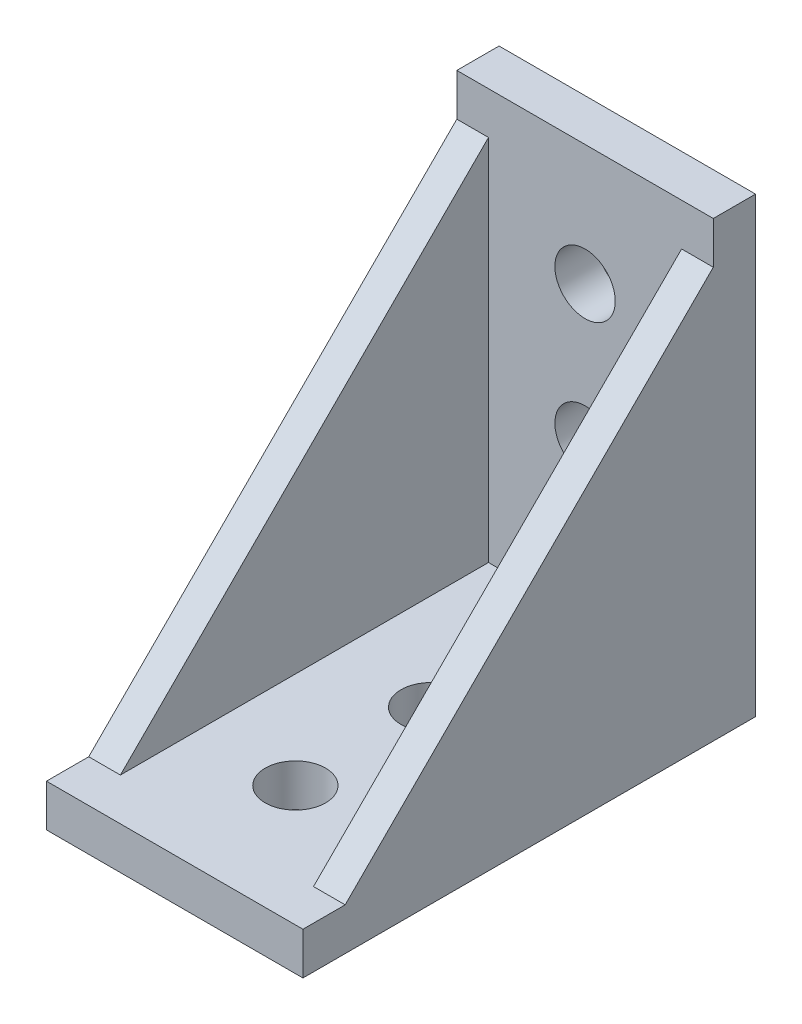
ISO-10303-21;
HEADER;
FILE_DESCRIPTION(('STEP AP214'),'2;1');
FILE_NAME('part.step','',(''),(''),'','','');
FILE_SCHEMA(('AUTOMOTIVE_DESIGN { 1 0 10303 214 1 1 1 1 }'));
ENDSEC;
DATA;
#1=APPLICATION_CONTEXT('core data for automotive mechanical design processes');
#2=APPLICATION_PROTOCOL_DEFINITION('international standard','automotive_design',2000,#1);
#3=PRODUCT_CONTEXT('',#1,'mechanical');
#4=PRODUCT('Part','Part','',(#3));
#5=PRODUCT_RELATED_PRODUCT_CATEGORY('part','',(#4));
#6=PRODUCT_DEFINITION_FORMATION('','',#4);
#7=PRODUCT_DEFINITION_CONTEXT('part definition',#1,'design');
#8=PRODUCT_DEFINITION('design','',#6,#7);
#9=PRODUCT_DEFINITION_SHAPE('','',#8);
#10=(LENGTH_UNIT() NAMED_UNIT(*) SI_UNIT(.MILLI.,.METRE.));
#11=(NAMED_UNIT(*) PLANE_ANGLE_UNIT() SI_UNIT($,.RADIAN.));
#12=(NAMED_UNIT(*) SI_UNIT($,.STERADIAN.) SOLID_ANGLE_UNIT());
#13=UNCERTAINTY_MEASURE_WITH_UNIT(LENGTH_MEASURE(1.E-05),#10,'distance_accuracy_value','');
#14=(GEOMETRIC_REPRESENTATION_CONTEXT(3) GLOBAL_UNCERTAINTY_ASSIGNED_CONTEXT((#13)) GLOBAL_UNIT_ASSIGNED_CONTEXT((#10,
#11,#12)) REPRESENTATION_CONTEXT('',''));
#15=CARTESIAN_POINT('',(0.,0.,0.));
#16=DIRECTION('',(0.,0.,1.));
#17=DIRECTION('',(1.,0.,0.));
#18=AXIS2_PLACEMENT_3D('',#15,#16,#17);
#19=CARTESIAN_POINT('',(17.,2.8,27.2));
#20=DIRECTION('',(0.,-0.707106781186547,-0.707106781186548));
#21=DIRECTION('',(0.,0.707106781186548,-0.707106781186547));
#22=AXIS2_PLACEMENT_3D('',#19,#20,#21);
#23=PLANE('',#22);
#24=DIRECTION('',(-1.,0.,0.));
#25=VECTOR('',#24,1.);
#26=CARTESIAN_POINT('',(17.,27.2,2.8));
#27=LINE('',#26,#25);
#28=CARTESIAN_POINT('',(17.,27.2,2.8));
#29=VERTEX_POINT('',#28);
#30=CARTESIAN_POINT('',(14.9,27.2,2.8));
#31=VERTEX_POINT('',#30);
#32=EDGE_CURVE('E157',#29,#31,#27,.T.);
#33=ORIENTED_EDGE('',*,*,#32,.T.);
#34=DIRECTION('',(0.,-0.707106781186548,0.707106781186547));
#35=VECTOR('',#34,1.);
#36=CARTESIAN_POINT('',(14.9,2.8,27.2));
#37=LINE('',#36,#35);
#38=CARTESIAN_POINT('',(14.9,2.79999999999999,27.2));
#39=VERTEX_POINT('',#38);
#40=EDGE_CURVE('E11',#31,#39,#37,.T.);
#41=ORIENTED_EDGE('',*,*,#40,.T.);
#42=DIRECTION('',(-1.,0.,0.));
#43=VECTOR('',#42,1.);
#44=CARTESIAN_POINT('',(17.,2.8,27.2));
#45=LINE('',#44,#43);
#46=CARTESIAN_POINT('',(17.,2.8,27.2));
#47=VERTEX_POINT('',#46);
#48=EDGE_CURVE('E154',#47,#39,#45,.T.);
#49=ORIENTED_EDGE('',*,*,#48,.F.);
#50=DIRECTION('',(0.,-0.707106781186548,0.707106781186547));
#51=VECTOR('',#50,1.);
#52=CARTESIAN_POINT('',(17.,2.8,27.2));
#53=LINE('',#52,#51);
#54=EDGE_CURVE('E115',#29,#47,#53,.T.);
#55=ORIENTED_EDGE('',*,*,#54,.F.);
#56=EDGE_LOOP('',(#33,#41,#49,#55));
#57=FACE_BOUND('',#56,.T.);
#58=ADVANCED_FACE('F34',(#57),#23,.F.);
#59=CARTESIAN_POINT('',(17.,30.,0.));
#60=DIRECTION('',(0.,0.,1.));
#61=DIRECTION('',(0.,-1.,0.));
#62=AXIS2_PLACEMENT_3D('',#59,#60,#61);
#63=PLANE('',#62);
#64=CARTESIAN_POINT('',(8.5,22.,0.));
#65=DIRECTION('',(0.,0.,1.));
#66=DIRECTION('',(1.,0.,0.));
#67=AXIS2_PLACEMENT_3D('',#64,#65,#66);
#68=CIRCLE('',#67,2.);
#69=CARTESIAN_POINT('',(10.5,22.,0.));
#70=VERTEX_POINT('',#69);
#71=EDGE_CURVE('E232',#70,#70,#68,.T.);
#72=ORIENTED_EDGE('',*,*,#71,.T.);
#73=EDGE_LOOP('',(#72));
#74=FACE_BOUND('',#73,.T.);
#75=CARTESIAN_POINT('',(8.5,13.,0.));
#76=DIRECTION('',(0.,0.,1.));
#77=DIRECTION('',(1.,0.,0.));
#78=AXIS2_PLACEMENT_3D('',#75,#76,#77);
#79=CIRCLE('',#78,2.);
#80=CARTESIAN_POINT('',(10.5,13.,0.));
#81=VERTEX_POINT('',#80);
#82=EDGE_CURVE('E241',#81,#81,#79,.T.);
#83=ORIENTED_EDGE('',*,*,#82,.T.);
#84=EDGE_LOOP('',(#83));
#85=FACE_BOUND('',#84,.T.);
#86=DIRECTION('',(0.,1.,0.));
#87=VECTOR('',#86,1.);
#88=CARTESIAN_POINT('',(0.,30.,0.));
#89=LINE('',#88,#87);
#90=CARTESIAN_POINT('',(0.,0.,0.));
#91=VERTEX_POINT('',#90);
#92=CARTESIAN_POINT('',(0.,30.,0.));
#93=VERTEX_POINT('',#92);
#94=EDGE_CURVE('E135',#91,#93,#89,.T.);
#95=ORIENTED_EDGE('',*,*,#94,.T.);
#96=DIRECTION('',(-1.,0.,0.));
#97=VECTOR('',#96,1.);
#98=CARTESIAN_POINT('',(17.,30.,0.));
#99=LINE('',#98,#97);
#100=CARTESIAN_POINT('',(17.,30.,0.));
#101=VERTEX_POINT('',#100);
#102=EDGE_CURVE('E162',#101,#93,#99,.T.);
#103=ORIENTED_EDGE('',*,*,#102,.F.);
#104=DIRECTION('',(0.,1.,0.));
#105=VECTOR('',#104,1.);
#106=CARTESIAN_POINT('',(17.,30.,0.));
#107=LINE('',#106,#105);
#108=CARTESIAN_POINT('',(17.,0.,0.));
#109=VERTEX_POINT('',#108);
#110=EDGE_CURVE('E151',#109,#101,#107,.T.);
#111=ORIENTED_EDGE('',*,*,#110,.F.);
#112=DIRECTION('',(-1.,0.,0.));
#113=VECTOR('',#112,1.);
#114=CARTESIAN_POINT('',(17.,0.,0.));
#115=LINE('',#114,#113);
#116=EDGE_CURVE('E131',#109,#91,#115,.T.);
#117=ORIENTED_EDGE('',*,*,#116,.T.);
#118=EDGE_LOOP('',(#95,#103,#111,#117));
#119=FACE_BOUND('',#118,.T.);
#120=ADVANCED_FACE('F36',(#74,#85,#119),#63,.F.);
#121=CARTESIAN_POINT('',(17.,30.,2.8));
#122=DIRECTION('',(0.,-1.,0.));
#123=DIRECTION('',(0.,0.,-1.));
#124=AXIS2_PLACEMENT_3D('',#121,#122,#123);
#125=PLANE('',#124);
#126=DIRECTION('',(0.,0.,1.));
#127=VECTOR('',#126,1.);
#128=CARTESIAN_POINT('',(0.,30.,2.8));
#129=LINE('',#128,#127);
#130=CARTESIAN_POINT('',(0.,30.,2.8));
#131=VERTEX_POINT('',#130);
#132=EDGE_CURVE('E138',#93,#131,#129,.T.);
#133=ORIENTED_EDGE('',*,*,#132,.T.);
#134=DIRECTION('',(-1.,0.,0.));
#135=VECTOR('',#134,1.);
#136=CARTESIAN_POINT('',(17.,30.,2.8));
#137=LINE('',#136,#135);
#138=CARTESIAN_POINT('',(17.,30.,2.8));
#139=VERTEX_POINT('',#138);
#140=EDGE_CURVE('E160',#139,#131,#137,.T.);
#141=ORIENTED_EDGE('',*,*,#140,.F.);
#142=DIRECTION('',(0.,0.,1.));
#143=VECTOR('',#142,1.);
#144=CARTESIAN_POINT('',(17.,30.,2.8));
#145=LINE('',#144,#143);
#146=EDGE_CURVE('E96',#101,#139,#145,.T.);
#147=ORIENTED_EDGE('',*,*,#146,.F.);
#148=ORIENTED_EDGE('',*,*,#102,.T.);
#149=EDGE_LOOP('',(#133,#141,#147,#148));
#150=FACE_BOUND('',#149,.T.);
#151=ADVANCED_FACE('F270',(#150),#125,.F.);
#152=CARTESIAN_POINT('',(17.,27.2,2.8));
#153=DIRECTION('',(0.,0.,-1.));
#154=DIRECTION('',(0.,1.,0.));
#155=AXIS2_PLACEMENT_3D('',#152,#153,#154);
#156=PLANE('',#155);
#157=CARTESIAN_POINT('',(8.5,22.,2.8));
#158=DIRECTION('',(0.,0.,-1.));
#159=DIRECTION('',(0.,1.,0.));
#160=AXIS2_PLACEMENT_3D('',#157,#158,#159);
#161=CIRCLE('',#160,2.);
#162=CARTESIAN_POINT('',(8.5,24.,2.8));
#163=VERTEX_POINT('',#162);
#164=EDGE_CURVE('E236',#163,#163,#161,.T.);
#165=ORIENTED_EDGE('',*,*,#164,.T.);
#166=EDGE_LOOP('',(#165));
#167=FACE_BOUND('',#166,.T.);
#168=CARTESIAN_POINT('',(8.5,13.,2.79999999999999));
#169=DIRECTION('',(0.,0.,-1.));
#170=DIRECTION('',(0.,1.,0.));
#171=AXIS2_PLACEMENT_3D('',#168,#169,#170);
#172=CIRCLE('',#171,2.);
#173=CARTESIAN_POINT('',(8.5,15.,2.79999999999999));
#174=VERTEX_POINT('',#173);
#175=EDGE_CURVE('E226',#174,#174,#172,.T.);
#176=ORIENTED_EDGE('',*,*,#175,.T.);
#177=EDGE_LOOP('',(#176));
#178=FACE_BOUND('',#177,.T.);
#179=CARTESIAN_POINT('',(2.1,27.2,2.8));
#180=VERTEX_POINT('',#179);
#181=CARTESIAN_POINT('',(0.,27.2,2.8));
#182=VERTEX_POINT('',#181);
#183=EDGE_CURVE('E156',#180,#182,#27,.T.);
#184=ORIENTED_EDGE('',*,*,#183,.F.);
#185=DIRECTION('',(0.,1.,0.));
#186=VECTOR('',#185,1.);
#187=CARTESIAN_POINT('',(2.1,-24.7535841588712,2.8));
#188=LINE('',#187,#186);
#189=CARTESIAN_POINT('',(2.1,2.8,2.8));
#190=VERTEX_POINT('',#189);
#191=EDGE_CURVE('E177',#190,#180,#188,.T.);
#192=ORIENTED_EDGE('',*,*,#191,.F.);
#193=DIRECTION('',(-1.,0.,0.));
#194=VECTOR('',#193,1.);
#195=CARTESIAN_POINT('',(17.,2.8,2.8));
#196=LINE('',#195,#194);
#197=CARTESIAN_POINT('',(14.9,2.8,2.8));
#198=VERTEX_POINT('',#197);
#199=EDGE_CURVE('E210',#198,#190,#196,.T.);
#200=ORIENTED_EDGE('',*,*,#199,.F.);
#201=DIRECTION('',(0.,1.,0.));
#202=VECTOR('',#201,1.);
#203=CARTESIAN_POINT('',(14.9,-24.7535841588712,2.8));
#204=LINE('',#203,#202);
#205=EDGE_CURVE('E192',#198,#31,#204,.T.);
#206=ORIENTED_EDGE('',*,*,#205,.T.);
#207=ORIENTED_EDGE('',*,*,#32,.F.);
#208=DIRECTION('',(0.,-1.,0.));
#209=VECTOR('',#208,1.);
#210=CARTESIAN_POINT('',(17.,27.2,2.8));
#211=LINE('',#210,#209);
#212=EDGE_CURVE('E189',#139,#29,#211,.T.);
#213=ORIENTED_EDGE('',*,*,#212,.F.);
#214=ORIENTED_EDGE('',*,*,#140,.T.);
#215=DIRECTION('',(0.,-1.,0.));
#216=VECTOR('',#215,1.);
#217=CARTESIAN_POINT('',(0.,27.2,2.8));
#218=LINE('',#217,#216);
#219=EDGE_CURVE('E141',#131,#182,#218,.T.);
#220=ORIENTED_EDGE('',*,*,#219,.T.);
#221=EDGE_LOOP('',(#184,#192,#200,#206,#207,#213,#214,#220));
#222=FACE_BOUND('',#221,.T.);
#223=ADVANCED_FACE('F174',(#167,#178,#222),#156,.F.);
#224=CARTESIAN_POINT('',(2.1,2.8,27.2));
#225=VERTEX_POINT('',#224);
#226=CARTESIAN_POINT('',(0.,2.8,27.2));
#227=VERTEX_POINT('',#226);
#228=EDGE_CURVE('E126',#225,#227,#45,.T.);
#229=ORIENTED_EDGE('',*,*,#228,.F.);
#230=DIRECTION('',(0.,0.707106781186548,-0.707106781186547));
#231=VECTOR('',#230,1.);
#232=CARTESIAN_POINT('',(2.1,2.8,27.2));
#233=LINE('',#232,#231);
#234=EDGE_CURVE('E42',#225,#180,#233,.T.);
#235=ORIENTED_EDGE('',*,*,#234,.T.);
#236=ORIENTED_EDGE('',*,*,#183,.T.);
#237=DIRECTION('',(0.,-0.707106781186548,0.707106781186547));
#238=VECTOR('',#237,1.);
#239=CARTESIAN_POINT('',(0.,2.8,27.2));
#240=LINE('',#239,#238);
#241=EDGE_CURVE('E144',#182,#227,#240,.T.);
#242=ORIENTED_EDGE('',*,*,#241,.T.);
#243=EDGE_LOOP('',(#229,#235,#236,#242));
#244=FACE_BOUND('',#243,.T.);
#245=ADVANCED_FACE('F168',(#244),#23,.F.);
#246=CARTESIAN_POINT('',(17.,2.8,30.));
#247=DIRECTION('',(0.,-1.,0.));
#248=DIRECTION('',(0.,0.,-1.));
#249=AXIS2_PLACEMENT_3D('',#246,#247,#248);
#250=PLANE('',#249);
#251=CARTESIAN_POINT('',(8.5,2.8,22.));
#252=DIRECTION('',(0.,-1.,0.));
#253=DIRECTION('',(0.,0.,-1.));
#254=AXIS2_PLACEMENT_3D('',#251,#252,#253);
#255=CIRCLE('',#254,2.);
#256=CARTESIAN_POINT('',(8.5,2.8,20.));
#257=VERTEX_POINT('',#256);
#258=EDGE_CURVE('E218',#257,#257,#255,.T.);
#259=ORIENTED_EDGE('',*,*,#258,.T.);
#260=EDGE_LOOP('',(#259));
#261=FACE_BOUND('',#260,.T.);
#262=CARTESIAN_POINT('',(8.5,2.8,13.));
#263=DIRECTION('',(0.,-1.,0.));
#264=DIRECTION('',(0.,0.,-1.));
#265=AXIS2_PLACEMENT_3D('',#262,#263,#264);
#266=CIRCLE('',#265,2.);
#267=CARTESIAN_POINT('',(8.5,2.8,11.));
#268=VERTEX_POINT('',#267);
#269=EDGE_CURVE('E213',#268,#268,#266,.T.);
#270=ORIENTED_EDGE('',*,*,#269,.T.);
#271=EDGE_LOOP('',(#270));
#272=FACE_BOUND('',#271,.T.);
#273=DIRECTION('',(0.,0.,1.));
#274=VECTOR('',#273,1.);
#275=CARTESIAN_POINT('',(0.,2.8,30.));
#276=LINE('',#275,#274);
#277=CARTESIAN_POINT('',(0.,2.8,30.));
#278=VERTEX_POINT('',#277);
#279=EDGE_CURVE('E123',#227,#278,#276,.T.);
#280=ORIENTED_EDGE('',*,*,#279,.T.);
#281=DIRECTION('',(-1.,0.,0.));
#282=VECTOR('',#281,1.);
#283=CARTESIAN_POINT('',(17.,2.8,30.));
#284=LINE('',#283,#282);
#285=CARTESIAN_POINT('',(17.,2.8,30.));
#286=VERTEX_POINT('',#285);
#287=EDGE_CURVE('E120',#286,#278,#284,.T.);
#288=ORIENTED_EDGE('',*,*,#287,.F.);
#289=DIRECTION('',(0.,0.,1.));
#290=VECTOR('',#289,1.);
#291=CARTESIAN_POINT('',(17.,2.8,30.));
#292=LINE('',#291,#290);
#293=EDGE_CURVE('E108',#47,#286,#292,.T.);
#294=ORIENTED_EDGE('',*,*,#293,.F.);
#295=ORIENTED_EDGE('',*,*,#48,.T.);
#296=DIRECTION('',(0.,0.,-1.));
#297=VECTOR('',#296,1.);
#298=CARTESIAN_POINT('',(14.9,2.8,2.8));
#299=LINE('',#298,#297);
#300=EDGE_CURVE('E203',#39,#198,#299,.T.);
#301=ORIENTED_EDGE('',*,*,#300,.T.);
#302=ORIENTED_EDGE('',*,*,#199,.T.);
#303=DIRECTION('',(0.,0.,1.));
#304=VECTOR('',#303,1.);
#305=CARTESIAN_POINT('',(2.1,2.8,2.8));
#306=LINE('',#305,#304);
#307=EDGE_CURVE('E49',#190,#225,#306,.T.);
#308=ORIENTED_EDGE('',*,*,#307,.T.);
#309=ORIENTED_EDGE('',*,*,#228,.T.);
#310=EDGE_LOOP('',(#280,#288,#294,#295,#301,#302,#308,#309));
#311=FACE_BOUND('',#310,.T.);
#312=ADVANCED_FACE('F121',(#261,#272,#311),#250,.F.);
#313=CARTESIAN_POINT('',(17.,0.,30.));
#314=DIRECTION('',(0.,0.,-1.));
#315=DIRECTION('',(-1.,0.,0.));
#316=AXIS2_PLACEMENT_3D('',#313,#314,#315);
#317=PLANE('',#316);
#318=DIRECTION('',(0.,-1.,0.));
#319=VECTOR('',#318,1.);
#320=CARTESIAN_POINT('',(0.,0.,30.));
#321=LINE('',#320,#319);
#322=CARTESIAN_POINT('',(0.,0.,30.));
#323=VERTEX_POINT('',#322);
#324=EDGE_CURVE('E148',#278,#323,#321,.T.);
#325=ORIENTED_EDGE('',*,*,#324,.T.);
#326=DIRECTION('',(-1.,0.,0.));
#327=VECTOR('',#326,1.);
#328=CARTESIAN_POINT('',(17.,0.,30.));
#329=LINE('',#328,#327);
#330=CARTESIAN_POINT('',(17.,0.,30.));
#331=VERTEX_POINT('',#330);
#332=EDGE_CURVE('E127',#331,#323,#329,.T.);
#333=ORIENTED_EDGE('',*,*,#332,.F.);
#334=DIRECTION('',(0.,-1.,0.));
#335=VECTOR('',#334,1.);
#336=CARTESIAN_POINT('',(17.,0.,30.));
#337=LINE('',#336,#335);
#338=EDGE_CURVE('E112',#286,#331,#337,.T.);
#339=ORIENTED_EDGE('',*,*,#338,.F.);
#340=ORIENTED_EDGE('',*,*,#287,.T.);
#341=EDGE_LOOP('',(#325,#333,#339,#340));
#342=FACE_BOUND('',#341,.T.);
#343=ADVANCED_FACE('F129',(#342),#317,.F.);
#344=CARTESIAN_POINT('',(17.,0.,0.));
#345=DIRECTION('',(0.,1.,0.));
#346=DIRECTION('',(0.,0.,1.));
#347=AXIS2_PLACEMENT_3D('',#344,#345,#346);
#348=PLANE('',#347);
#349=CARTESIAN_POINT('',(8.5,0.,22.));
#350=DIRECTION('',(0.,1.,0.));
#351=DIRECTION('',(0.,0.,1.));
#352=AXIS2_PLACEMENT_3D('',#349,#350,#351);
#353=CIRCLE('',#352,2.);
#354=CARTESIAN_POINT('',(8.5,0.,24.));
#355=VERTEX_POINT('',#354);
#356=EDGE_CURVE('E216',#355,#355,#353,.T.);
#357=ORIENTED_EDGE('',*,*,#356,.T.);
#358=EDGE_LOOP('',(#357));
#359=FACE_BOUND('',#358,.T.);
#360=CARTESIAN_POINT('',(8.5,0.,13.));
#361=DIRECTION('',(0.,1.,0.));
#362=DIRECTION('',(0.,0.,1.));
#363=AXIS2_PLACEMENT_3D('',#360,#361,#362);
#364=CIRCLE('',#363,2.);
#365=CARTESIAN_POINT('',(8.5,0.,15.));
#366=VERTEX_POINT('',#365);
#367=EDGE_CURVE('E223',#366,#366,#364,.T.);
#368=ORIENTED_EDGE('',*,*,#367,.T.);
#369=EDGE_LOOP('',(#368));
#370=FACE_BOUND('',#369,.T.);
#371=DIRECTION('',(0.,0.,-1.));
#372=VECTOR('',#371,1.);
#373=CARTESIAN_POINT('',(0.,0.,0.));
#374=LINE('',#373,#372);
#375=EDGE_CURVE('E87',#323,#91,#374,.T.);
#376=ORIENTED_EDGE('',*,*,#375,.T.);
#377=ORIENTED_EDGE('',*,*,#116,.F.);
#378=DIRECTION('',(0.,0.,-1.));
#379=VECTOR('',#378,1.);
#380=CARTESIAN_POINT('',(17.,0.,0.));
#381=LINE('',#380,#379);
#382=EDGE_CURVE('E58',#331,#109,#381,.T.);
#383=ORIENTED_EDGE('',*,*,#382,.F.);
#384=ORIENTED_EDGE('',*,*,#332,.T.);
#385=EDGE_LOOP('',(#376,#377,#383,#384));
#386=FACE_BOUND('',#385,.T.);
#387=ADVANCED_FACE('F184',(#359,#370,#386),#348,.F.);
#388=CARTESIAN_POINT('',(17.,0.,0.));
#389=DIRECTION('',(-1.,0.,0.));
#390=DIRECTION('',(0.,0.,1.));
#391=AXIS2_PLACEMENT_3D('',#388,#389,#390);
#392=PLANE('',#391);
#393=ORIENTED_EDGE('',*,*,#110,.T.);
#394=ORIENTED_EDGE('',*,*,#146,.T.);
#395=ORIENTED_EDGE('',*,*,#212,.T.);
#396=ORIENTED_EDGE('',*,*,#54,.T.);
#397=ORIENTED_EDGE('',*,*,#293,.T.);
#398=ORIENTED_EDGE('',*,*,#338,.T.);
#399=ORIENTED_EDGE('',*,*,#382,.T.);
#400=EDGE_LOOP('',(#393,#394,#395,#396,#397,#398,#399));
#401=FACE_BOUND('',#400,.T.);
#402=ADVANCED_FACE('F110',(#401),#392,.F.);
#403=CARTESIAN_POINT('',(0.,0.,0.));
#404=DIRECTION('',(-1.,0.,0.));
#405=DIRECTION('',(0.,0.,1.));
#406=AXIS2_PLACEMENT_3D('',#403,#404,#405);
#407=PLANE('',#406);
#408=ORIENTED_EDGE('',*,*,#94,.F.);
#409=ORIENTED_EDGE('',*,*,#375,.F.);
#410=ORIENTED_EDGE('',*,*,#324,.F.);
#411=ORIENTED_EDGE('',*,*,#279,.F.);
#412=ORIENTED_EDGE('',*,*,#241,.F.);
#413=ORIENTED_EDGE('',*,*,#219,.F.);
#414=ORIENTED_EDGE('',*,*,#132,.F.);
#415=EDGE_LOOP('',(#408,#409,#410,#411,#412,#413,#414));
#416=FACE_BOUND('',#415,.T.);
#417=ADVANCED_FACE('F183',(#416),#407,.T.);
#418=CARTESIAN_POINT('',(14.9,-24.7535841588712,2.8));
#419=DIRECTION('',(1.,0.,0.));
#420=DIRECTION('',(0.,0.,-1.));
#421=AXIS2_PLACEMENT_3D('',#418,#419,#420);
#422=PLANE('',#421);
#423=ORIENTED_EDGE('',*,*,#205,.F.);
#424=ORIENTED_EDGE('',*,*,#300,.F.);
#425=ORIENTED_EDGE('',*,*,#40,.F.);
#426=EDGE_LOOP('',(#423,#424,#425));
#427=FACE_BOUND('',#426,.T.);
#428=ADVANCED_FACE('F332',(#427),#422,.F.);
#429=CARTESIAN_POINT('',(2.1,-24.7535841588712,2.8));
#430=DIRECTION('',(-1.,0.,0.));
#431=DIRECTION('',(0.,0.,1.));
#432=AXIS2_PLACEMENT_3D('',#429,#430,#431);
#433=PLANE('',#432);
#434=ORIENTED_EDGE('',*,*,#307,.F.);
#435=ORIENTED_EDGE('',*,*,#191,.T.);
#436=ORIENTED_EDGE('',*,*,#234,.F.);
#437=EDGE_LOOP('',(#434,#435,#436));
#438=FACE_BOUND('',#437,.T.);
#439=ADVANCED_FACE('F208',(#438),#433,.F.);
#440=CARTESIAN_POINT('',(8.5,30.001,13.));
#441=DIRECTION('',(0.,-1.,0.));
#442=DIRECTION('',(0.,0.,-1.));
#443=AXIS2_PLACEMENT_3D('',#440,#441,#442);
#444=CYLINDRICAL_SURFACE('',#443,2.);
#445=ORIENTED_EDGE('',*,*,#367,.F.);
#446=EDGE_LOOP('',(#445));
#447=FACE_BOUND('',#446,.T.);
#448=ORIENTED_EDGE('',*,*,#269,.F.);
#449=EDGE_LOOP('',(#448));
#450=FACE_BOUND('',#449,.T.);
#451=ADVANCED_FACE('F262',(#447,#450),#444,.F.);
#452=CARTESIAN_POINT('',(8.5,30.001,22.));
#453=DIRECTION('',(0.,-1.,0.));
#454=DIRECTION('',(0.,0.,-1.));
#455=AXIS2_PLACEMENT_3D('',#452,#453,#454);
#456=CYLINDRICAL_SURFACE('',#455,2.);
#457=ORIENTED_EDGE('',*,*,#356,.F.);
#458=EDGE_LOOP('',(#457));
#459=FACE_BOUND('',#458,.T.);
#460=ORIENTED_EDGE('',*,*,#258,.F.);
#461=EDGE_LOOP('',(#460));
#462=FACE_BOUND('',#461,.T.);
#463=ADVANCED_FACE('F253',(#459,#462),#456,.F.);
#464=CARTESIAN_POINT('',(8.5,13.,30.001));
#465=DIRECTION('',(0.,0.,-1.));
#466=DIRECTION('',(-1.,0.,0.));
#467=AXIS2_PLACEMENT_3D('',#464,#465,#466);
#468=CYLINDRICAL_SURFACE('',#467,2.);
#469=ORIENTED_EDGE('',*,*,#82,.F.);
#470=EDGE_LOOP('',(#469));
#471=FACE_BOUND('',#470,.T.);
#472=ORIENTED_EDGE('',*,*,#175,.F.);
#473=EDGE_LOOP('',(#472));
#474=FACE_BOUND('',#473,.T.);
#475=ADVANCED_FACE('F250',(#471,#474),#468,.F.);
#476=CARTESIAN_POINT('',(8.5,22.,30.001));
#477=DIRECTION('',(0.,0.,-1.));
#478=DIRECTION('',(-1.,0.,0.));
#479=AXIS2_PLACEMENT_3D('',#476,#477,#478);
#480=CYLINDRICAL_SURFACE('',#479,2.);
#481=ORIENTED_EDGE('',*,*,#71,.F.);
#482=EDGE_LOOP('',(#481));
#483=FACE_BOUND('',#482,.T.);
#484=ORIENTED_EDGE('',*,*,#164,.F.);
#485=EDGE_LOOP('',(#484));
#486=FACE_BOUND('',#485,.T.);
#487=ADVANCED_FACE('F252',(#483,#486),#480,.F.);
#488=CLOSED_SHELL('',(#58,#120,#151,#223,#245,#312,#343,#387,#402,#417,#428,#439,#451,#463,#475,#487));
#489=MANIFOLD_SOLID_BREP('B2',#488);
#490=ADVANCED_BREP_SHAPE_REPRESENTATION('',(#18,#489),#14);
#491=SHAPE_DEFINITION_REPRESENTATION(#9,#490);
ENDSEC;
END-ISO-10303-21;
